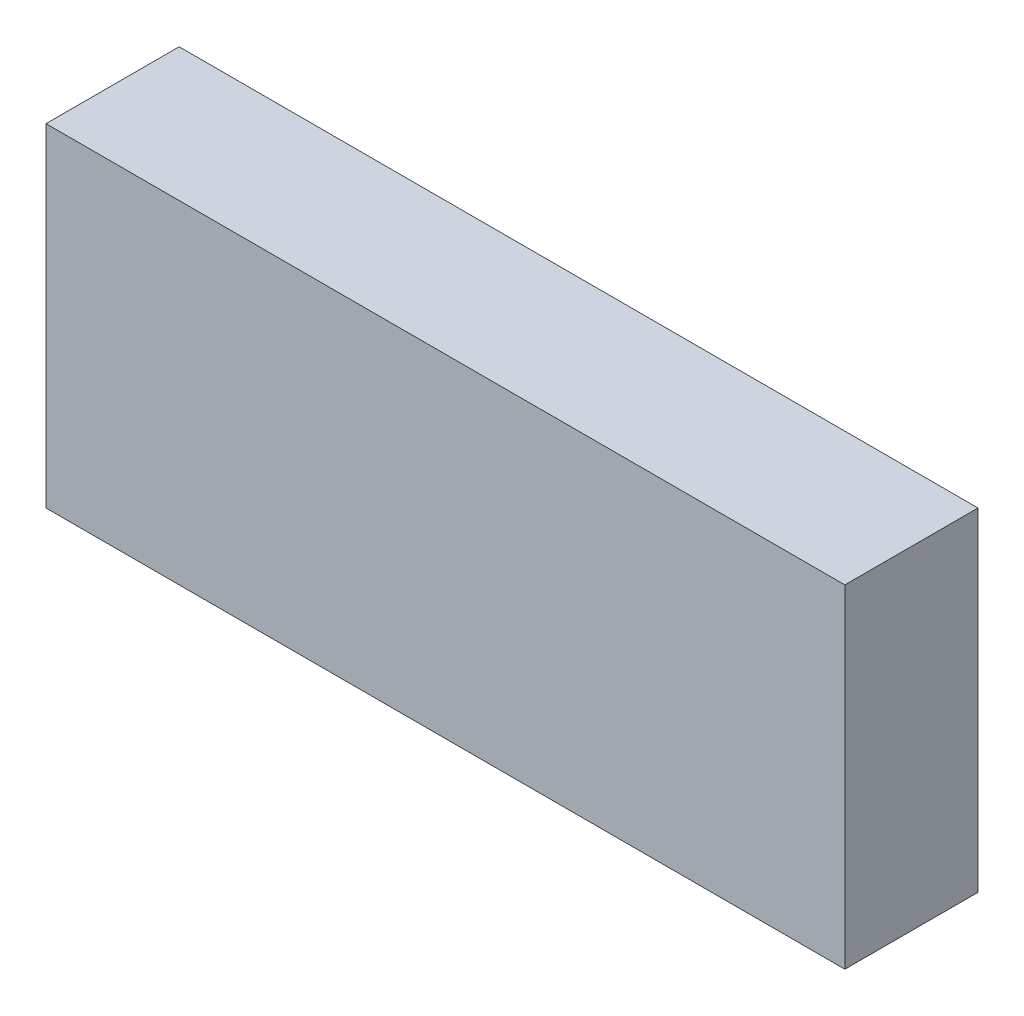
ISO-10303-21;
HEADER;
FILE_DESCRIPTION(('STEP AP214'),'2;1');
FILE_NAME('part.step','',(''),(''),'','','');
FILE_SCHEMA(('AUTOMOTIVE_DESIGN { 1 0 10303 214 1 1 1 1 }'));
ENDSEC;
DATA;
#1=APPLICATION_CONTEXT('core data for automotive mechanical design processes');
#2=APPLICATION_PROTOCOL_DEFINITION('international standard','automotive_design',2000,#1);
#3=PRODUCT_CONTEXT('',#1,'mechanical');
#4=PRODUCT('Part','Part','',(#3));
#5=PRODUCT_RELATED_PRODUCT_CATEGORY('part','',(#4));
#6=PRODUCT_DEFINITION_FORMATION('','',#4);
#7=PRODUCT_DEFINITION_CONTEXT('part definition',#1,'design');
#8=PRODUCT_DEFINITION('design','',#6,#7);
#9=PRODUCT_DEFINITION_SHAPE('','',#8);
#10=(LENGTH_UNIT() NAMED_UNIT(*) SI_UNIT(.MILLI.,.METRE.));
#11=(NAMED_UNIT(*) PLANE_ANGLE_UNIT() SI_UNIT($,.RADIAN.));
#12=(NAMED_UNIT(*) SI_UNIT($,.STERADIAN.) SOLID_ANGLE_UNIT());
#13=UNCERTAINTY_MEASURE_WITH_UNIT(LENGTH_MEASURE(1.E-05),#10,'distance_accuracy_value','');
#14=(GEOMETRIC_REPRESENTATION_CONTEXT(3) GLOBAL_UNCERTAINTY_ASSIGNED_CONTEXT((#13)) GLOBAL_UNIT_ASSIGNED_CONTEXT((#10,
#11,#12)) REPRESENTATION_CONTEXT('',''));
#15=CARTESIAN_POINT('',(0.,0.,0.));
#16=DIRECTION('',(0.,0.,1.));
#17=DIRECTION('',(1.,0.,0.));
#18=AXIS2_PLACEMENT_3D('',#15,#16,#17);
#19=CARTESIAN_POINT('',(-60.,25.,20.));
#20=DIRECTION('',(1.,0.,0.));
#21=DIRECTION('',(0.,0.,-1.));
#22=AXIS2_PLACEMENT_3D('',#19,#20,#21);
#23=PLANE('',#22);
#24=DIRECTION('',(0.,-1.,0.));
#25=VECTOR('',#24,1.);
#26=CARTESIAN_POINT('',(-60.,25.,0.));
#27=LINE('',#26,#25);
#28=CARTESIAN_POINT('',(-60.,25.,0.));
#29=VERTEX_POINT('',#28);
#30=CARTESIAN_POINT('',(-60.,-25.,0.));
#31=VERTEX_POINT('',#30);
#32=EDGE_CURVE('E96',#29,#31,#27,.T.);
#33=ORIENTED_EDGE('',*,*,#32,.T.);
#34=DIRECTION('',(0.,0.,-1.));
#35=VECTOR('',#34,1.);
#36=CARTESIAN_POINT('',(-60.,-25.,20.));
#37=LINE('',#36,#35);
#38=CARTESIAN_POINT('',(-60.,-25.,20.));
#39=VERTEX_POINT('',#38);
#40=EDGE_CURVE('E11',#39,#31,#37,.T.);
#41=ORIENTED_EDGE('',*,*,#40,.F.);
#42=DIRECTION('',(0.,-1.,0.));
#43=VECTOR('',#42,1.);
#44=CARTESIAN_POINT('',(-60.,25.,20.));
#45=LINE('',#44,#43);
#46=CARTESIAN_POINT('',(-60.,25.,20.));
#47=VERTEX_POINT('',#46);
#48=EDGE_CURVE('E84',#47,#39,#45,.T.);
#49=ORIENTED_EDGE('',*,*,#48,.F.);
#50=DIRECTION('',(0.,0.,-1.));
#51=VECTOR('',#50,1.);
#52=CARTESIAN_POINT('',(-60.,25.,20.));
#53=LINE('',#52,#51);
#54=EDGE_CURVE('E92',#47,#29,#53,.T.);
#55=ORIENTED_EDGE('',*,*,#54,.T.);
#56=EDGE_LOOP('',(#33,#41,#49,#55));
#57=FACE_BOUND('',#56,.T.);
#58=ADVANCED_FACE('F33',(#57),#23,.F.);
#59=CARTESIAN_POINT('',(60.,-25.,20.));
#60=DIRECTION('',(0.,1.,0.));
#61=DIRECTION('',(0.,0.,1.));
#62=AXIS2_PLACEMENT_3D('',#59,#60,#61);
#63=PLANE('',#62);
#64=DIRECTION('',(1.,0.,0.));
#65=VECTOR('',#64,1.);
#66=CARTESIAN_POINT('',(60.,-25.,0.));
#67=LINE('',#66,#65);
#68=CARTESIAN_POINT('',(60.,-25.,0.));
#69=VERTEX_POINT('',#68);
#70=EDGE_CURVE('E88',#31,#69,#67,.T.);
#71=ORIENTED_EDGE('',*,*,#70,.T.);
#72=DIRECTION('',(0.,0.,-1.));
#73=VECTOR('',#72,1.);
#74=CARTESIAN_POINT('',(60.,-25.,20.));
#75=LINE('',#74,#73);
#76=CARTESIAN_POINT('',(60.,-25.,20.));
#77=VERTEX_POINT('',#76);
#78=EDGE_CURVE('E41',#77,#69,#75,.T.);
#79=ORIENTED_EDGE('',*,*,#78,.F.);
#80=DIRECTION('',(1.,0.,0.));
#81=VECTOR('',#80,1.);
#82=CARTESIAN_POINT('',(60.,-25.,20.));
#83=LINE('',#82,#81);
#84=EDGE_CURVE('E79',#39,#77,#83,.T.);
#85=ORIENTED_EDGE('',*,*,#84,.F.);
#86=ORIENTED_EDGE('',*,*,#40,.T.);
#87=EDGE_LOOP('',(#71,#79,#85,#86));
#88=FACE_BOUND('',#87,.T.);
#89=ADVANCED_FACE('F87',(#88),#63,.F.);
#90=CARTESIAN_POINT('',(60.,25.,20.));
#91=DIRECTION('',(-1.,0.,0.));
#92=DIRECTION('',(0.,0.,1.));
#93=AXIS2_PLACEMENT_3D('',#90,#91,#92);
#94=PLANE('',#93);
#95=DIRECTION('',(0.,1.,0.));
#96=VECTOR('',#95,1.);
#97=CARTESIAN_POINT('',(60.,25.,0.));
#98=LINE('',#97,#96);
#99=CARTESIAN_POINT('',(60.,25.,0.));
#100=VERTEX_POINT('',#99);
#101=EDGE_CURVE('E66',#69,#100,#98,.T.);
#102=ORIENTED_EDGE('',*,*,#101,.T.);
#103=DIRECTION('',(0.,0.,-1.));
#104=VECTOR('',#103,1.);
#105=CARTESIAN_POINT('',(60.,25.,20.));
#106=LINE('',#105,#104);
#107=CARTESIAN_POINT('',(60.,25.,20.));
#108=VERTEX_POINT('',#107);
#109=EDGE_CURVE('E89',#108,#100,#106,.T.);
#110=ORIENTED_EDGE('',*,*,#109,.F.);
#111=DIRECTION('',(0.,1.,0.));
#112=VECTOR('',#111,1.);
#113=CARTESIAN_POINT('',(60.,25.,20.));
#114=LINE('',#113,#112);
#115=EDGE_CURVE('E82',#77,#108,#114,.T.);
#116=ORIENTED_EDGE('',*,*,#115,.F.);
#117=ORIENTED_EDGE('',*,*,#78,.T.);
#118=EDGE_LOOP('',(#102,#110,#116,#117));
#119=FACE_BOUND('',#118,.T.);
#120=ADVANCED_FACE('F90',(#119),#94,.F.);
#121=CARTESIAN_POINT('',(60.,25.,20.));
#122=DIRECTION('',(0.,-1.,0.));
#123=DIRECTION('',(0.,0.,-1.));
#124=AXIS2_PLACEMENT_3D('',#121,#122,#123);
#125=PLANE('',#124);
#126=DIRECTION('',(-1.,0.,0.));
#127=VECTOR('',#126,1.);
#128=CARTESIAN_POINT('',(60.,25.,0.));
#129=LINE('',#128,#127);
#130=EDGE_CURVE('E72',#100,#29,#129,.T.);
#131=ORIENTED_EDGE('',*,*,#130,.T.);
#132=ORIENTED_EDGE('',*,*,#54,.F.);
#133=DIRECTION('',(-1.,0.,0.));
#134=VECTOR('',#133,1.);
#135=CARTESIAN_POINT('',(60.,25.,20.));
#136=LINE('',#135,#134);
#137=EDGE_CURVE('E49',#108,#47,#136,.T.);
#138=ORIENTED_EDGE('',*,*,#137,.F.);
#139=ORIENTED_EDGE('',*,*,#109,.T.);
#140=EDGE_LOOP('',(#131,#132,#138,#139));
#141=FACE_BOUND('',#140,.T.);
#142=ADVANCED_FACE('F103',(#141),#125,.F.);
#143=CARTESIAN_POINT('',(0.,0.,20.));
#144=DIRECTION('',(0.,0.,-1.));
#145=DIRECTION('',(-1.,0.,0.));
#146=AXIS2_PLACEMENT_3D('',#143,#144,#145);
#147=PLANE('',#146);
#148=ORIENTED_EDGE('',*,*,#48,.T.);
#149=ORIENTED_EDGE('',*,*,#84,.T.);
#150=ORIENTED_EDGE('',*,*,#115,.T.);
#151=ORIENTED_EDGE('',*,*,#137,.T.);
#152=EDGE_LOOP('',(#148,#149,#150,#151));
#153=FACE_BOUND('',#152,.T.);
#154=ADVANCED_FACE('F80',(#153),#147,.F.);
#155=CARTESIAN_POINT('',(0.,0.,0.));
#156=DIRECTION('',(0.,0.,-1.));
#157=DIRECTION('',(-1.,0.,0.));
#158=AXIS2_PLACEMENT_3D('',#155,#156,#157);
#159=PLANE('',#158);
#160=ORIENTED_EDGE('',*,*,#32,.F.);
#161=ORIENTED_EDGE('',*,*,#130,.F.);
#162=ORIENTED_EDGE('',*,*,#101,.F.);
#163=ORIENTED_EDGE('',*,*,#70,.F.);
#164=EDGE_LOOP('',(#160,#161,#162,#163));
#165=FACE_BOUND('',#164,.T.);
#166=ADVANCED_FACE('F106',(#165),#159,.T.);
#167=CLOSED_SHELL('',(#58,#89,#120,#142,#154,#166));
#168=MANIFOLD_SOLID_BREP('B2',#167);
#169=ADVANCED_BREP_SHAPE_REPRESENTATION('',(#18,#168),#14);
#170=SHAPE_DEFINITION_REPRESENTATION(#9,#169);
ENDSEC;
END-ISO-10303-21;
